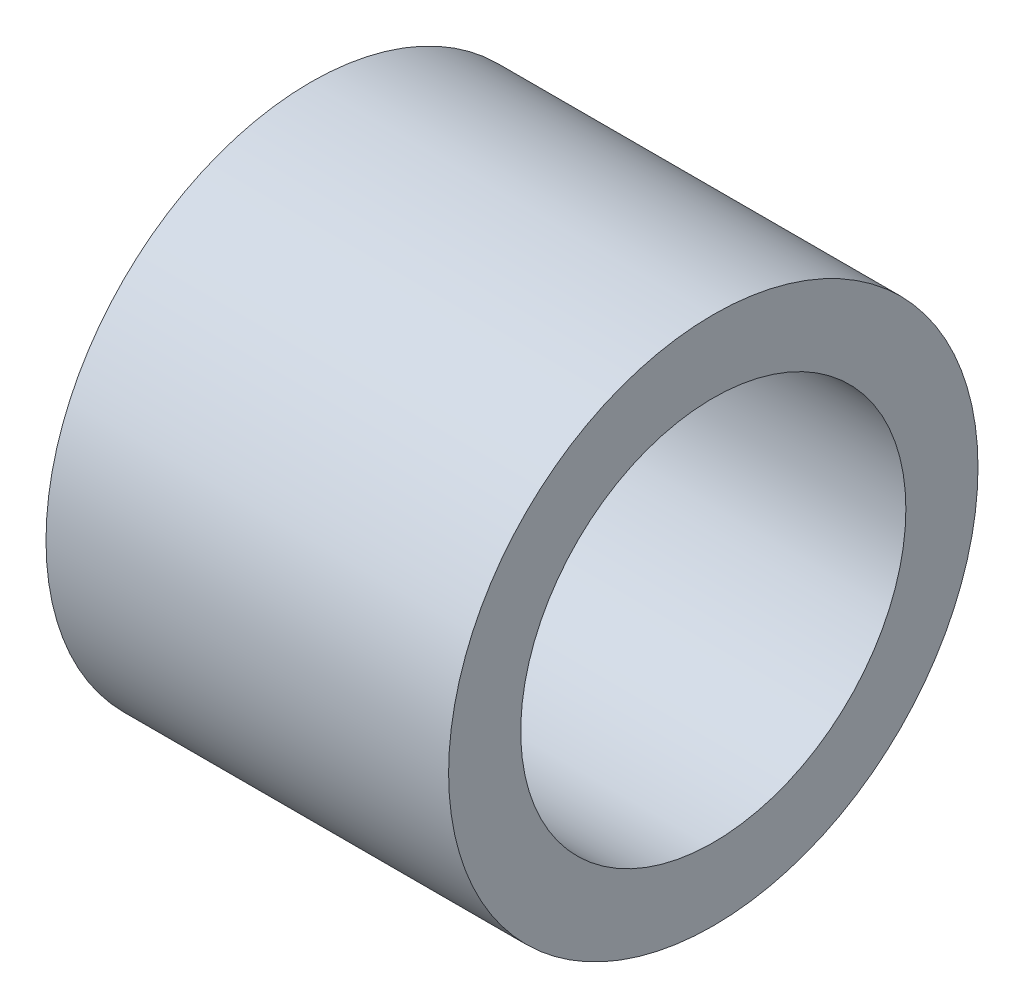
ISO-10303-21;
HEADER;
FILE_DESCRIPTION(('STEP AP214'),'2;1');
FILE_NAME('part.step','',(''),(''),'','','');
FILE_SCHEMA(('AUTOMOTIVE_DESIGN { 1 0 10303 214 1 1 1 1 }'));
ENDSEC;
DATA;
#1=APPLICATION_CONTEXT('core data for automotive mechanical design processes');
#2=APPLICATION_PROTOCOL_DEFINITION('international standard','automotive_design',2000,#1);
#3=PRODUCT_CONTEXT('',#1,'mechanical');
#4=PRODUCT('Part','Part','',(#3));
#5=PRODUCT_RELATED_PRODUCT_CATEGORY('part','',(#4));
#6=PRODUCT_DEFINITION_FORMATION('','',#4);
#7=PRODUCT_DEFINITION_CONTEXT('part definition',#1,'design');
#8=PRODUCT_DEFINITION('design','',#6,#7);
#9=PRODUCT_DEFINITION_SHAPE('','',#8);
#10=(LENGTH_UNIT() NAMED_UNIT(*) SI_UNIT(.MILLI.,.METRE.));
#11=(NAMED_UNIT(*) PLANE_ANGLE_UNIT() SI_UNIT($,.RADIAN.));
#12=(NAMED_UNIT(*) SI_UNIT($,.STERADIAN.) SOLID_ANGLE_UNIT());
#13=UNCERTAINTY_MEASURE_WITH_UNIT(LENGTH_MEASURE(1.E-05),#10,'distance_accuracy_value','');
#14=(GEOMETRIC_REPRESENTATION_CONTEXT(3) GLOBAL_UNCERTAINTY_ASSIGNED_CONTEXT((#13)) GLOBAL_UNIT_ASSIGNED_CONTEXT((#10,
#11,#12)) REPRESENTATION_CONTEXT('',''));
#15=CARTESIAN_POINT('',(0.,0.,0.));
#16=DIRECTION('',(0.,0.,1.));
#17=DIRECTION('',(1.,0.,0.));
#18=AXIS2_PLACEMENT_3D('',#15,#16,#17);
#19=CARTESIAN_POINT('',(25.4,0.,0.));
#20=DIRECTION('',(1.,0.,0.));
#21=DIRECTION('',(0.,0.,-0.999999999999997));
#22=AXIS2_PLACEMENT_3D('',#19,#20,#21);
#23=PLANE('',#22);
#24=CARTESIAN_POINT('',(25.4,0.,0.));
#25=DIRECTION('',(1.,0.,0.));
#26=DIRECTION('',(0.,0.,-0.999999999999997));
#27=AXIS2_PLACEMENT_3D('',#24,#25,#26);
#28=CIRCLE('',#27,16.7);
#29=CARTESIAN_POINT('',(25.4,0.,-16.6999999999999));
#30=VERTEX_POINT('',#29);
#31=EDGE_CURVE('E12',#30,#30,#28,.T.);
#32=ORIENTED_EDGE('',*,*,#31,.T.);
#33=EDGE_LOOP('',(#32));
#34=FACE_BOUND('',#33,.T.);
#35=CARTESIAN_POINT('',(25.4,0.,0.));
#36=DIRECTION('',(1.,0.,0.));
#37=DIRECTION('',(0.,0.,-0.999999999999997));
#38=AXIS2_PLACEMENT_3D('',#35,#36,#37);
#39=CIRCLE('',#38,12.15);
#40=CARTESIAN_POINT('',(25.4,0.,-12.1499999999999));
#41=VERTEX_POINT('',#40);
#42=EDGE_CURVE('E55',#41,#41,#39,.T.);
#43=ORIENTED_EDGE('',*,*,#42,.F.);
#44=EDGE_LOOP('',(#43));
#45=FACE_BOUND('',#44,.T.);
#46=ADVANCED_FACE('F44',(#34,#45),#23,.T.);
#47=CARTESIAN_POINT('',(0.,0.,0.));
#48=DIRECTION('',(1.,0.,0.));
#49=DIRECTION('',(0.,0.,-0.999999999999997));
#50=AXIS2_PLACEMENT_3D('',#47,#48,#49);
#51=PLANE('',#50);
#52=CARTESIAN_POINT('',(0.,0.,0.));
#53=DIRECTION('',(1.,0.,0.));
#54=DIRECTION('',(0.,0.,-0.999999999999997));
#55=AXIS2_PLACEMENT_3D('',#52,#53,#54);
#56=CIRCLE('',#55,16.7);
#57=CARTESIAN_POINT('',(0.,0.,-16.7));
#58=VERTEX_POINT('',#57);
#59=EDGE_CURVE('E48',#58,#58,#56,.T.);
#60=ORIENTED_EDGE('',*,*,#59,.F.);
#61=EDGE_LOOP('',(#60));
#62=FACE_BOUND('',#61,.T.);
#63=CARTESIAN_POINT('',(0.,0.,0.));
#64=DIRECTION('',(1.,0.,0.));
#65=DIRECTION('',(0.,0.,-0.999999999999997));
#66=AXIS2_PLACEMENT_3D('',#63,#64,#65);
#67=CIRCLE('',#66,12.15);
#68=CARTESIAN_POINT('',(0.,0.,-12.15));
#69=VERTEX_POINT('',#68);
#70=EDGE_CURVE('E57',#69,#69,#67,.T.);
#71=ORIENTED_EDGE('',*,*,#70,.T.);
#72=EDGE_LOOP('',(#71));
#73=FACE_BOUND('',#72,.T.);
#74=ADVANCED_FACE('F67',(#62,#73),#51,.F.);
#75=CARTESIAN_POINT('',(25.4,0.,0.));
#76=DIRECTION('',(-1.,0.,0.));
#77=DIRECTION('',(0.,0.,0.999999999999997));
#78=AXIS2_PLACEMENT_3D('',#75,#76,#77);
#79=CYLINDRICAL_SURFACE('',#78,16.7);
#80=ORIENTED_EDGE('',*,*,#31,.F.);
#81=EDGE_LOOP('',(#80));
#82=FACE_BOUND('',#81,.T.);
#83=ORIENTED_EDGE('',*,*,#59,.T.);
#84=EDGE_LOOP('',(#83));
#85=FACE_BOUND('',#84,.T.);
#86=ADVANCED_FACE('F46',(#82,#85),#79,.T.);
#87=CARTESIAN_POINT('',(25.4,0.,0.));
#88=DIRECTION('',(-1.,0.,0.));
#89=DIRECTION('',(0.,0.,0.999999999999997));
#90=AXIS2_PLACEMENT_3D('',#87,#88,#89);
#91=CYLINDRICAL_SURFACE('',#90,12.15);
#92=ORIENTED_EDGE('',*,*,#42,.T.);
#93=EDGE_LOOP('',(#92));
#94=FACE_BOUND('',#93,.T.);
#95=ORIENTED_EDGE('',*,*,#70,.F.);
#96=EDGE_LOOP('',(#95));
#97=FACE_BOUND('',#96,.T.);
#98=ADVANCED_FACE('F63',(#94,#97),#91,.F.);
#99=CLOSED_SHELL('',(#46,#74,#86,#98));
#100=MANIFOLD_SOLID_BREP('B2',#99);
#101=ADVANCED_BREP_SHAPE_REPRESENTATION('',(#18,#100),#14);
#102=SHAPE_DEFINITION_REPRESENTATION(#9,#101);
ENDSEC;
END-ISO-10303-21;
